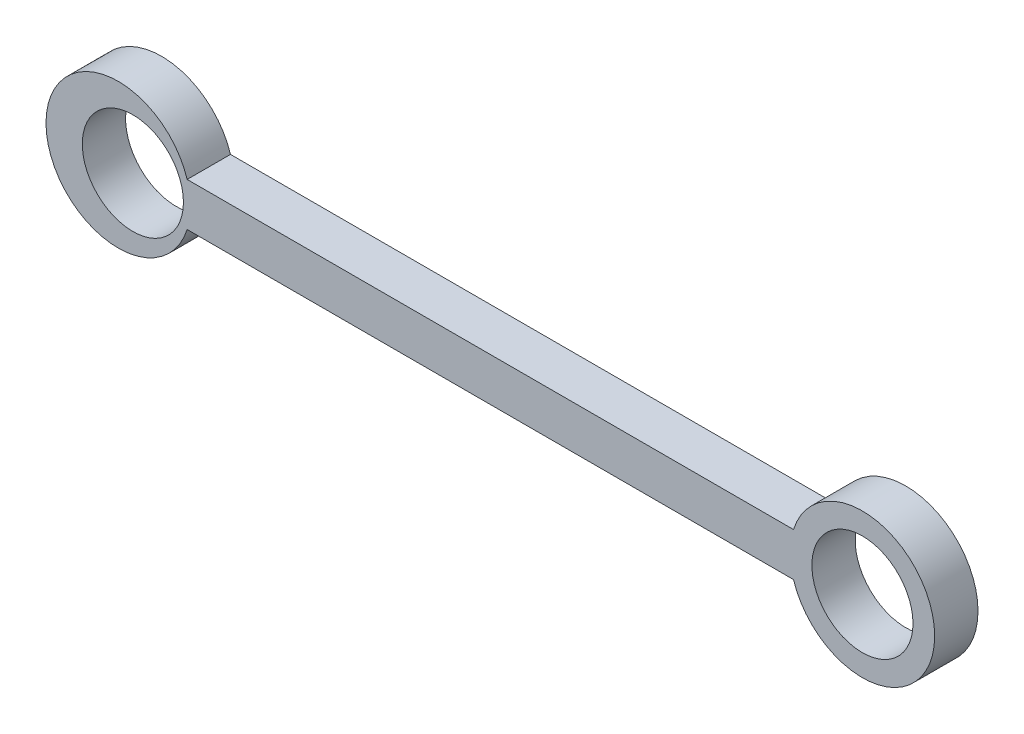
ISO-10303-21;
HEADER;
FILE_DESCRIPTION(('STEP AP214'),'2;1');
FILE_NAME('part.step','',(''),(''),'','','');
FILE_SCHEMA(('AUTOMOTIVE_DESIGN { 1 0 10303 214 1 1 1 1 }'));
ENDSEC;
DATA;
#1=APPLICATION_CONTEXT('core data for automotive mechanical design processes');
#2=APPLICATION_PROTOCOL_DEFINITION('international standard','automotive_design',2000,#1);
#3=PRODUCT_CONTEXT('',#1,'mechanical');
#4=PRODUCT('Part','Part','',(#3));
#5=PRODUCT_RELATED_PRODUCT_CATEGORY('part','',(#4));
#6=PRODUCT_DEFINITION_FORMATION('','',#4);
#7=PRODUCT_DEFINITION_CONTEXT('part definition',#1,'design');
#8=PRODUCT_DEFINITION('design','',#6,#7);
#9=PRODUCT_DEFINITION_SHAPE('','',#8);
#10=(LENGTH_UNIT() NAMED_UNIT(*) SI_UNIT(.MILLI.,.METRE.));
#11=(NAMED_UNIT(*) PLANE_ANGLE_UNIT() SI_UNIT($,.RADIAN.));
#12=(NAMED_UNIT(*) SI_UNIT($,.STERADIAN.) SOLID_ANGLE_UNIT());
#13=UNCERTAINTY_MEASURE_WITH_UNIT(LENGTH_MEASURE(1.E-05),#10,'distance_accuracy_value','');
#14=(GEOMETRIC_REPRESENTATION_CONTEXT(3) GLOBAL_UNCERTAINTY_ASSIGNED_CONTEXT((#13)) GLOBAL_UNIT_ASSIGNED_CONTEXT((#10,
#11,#12)) REPRESENTATION_CONTEXT('',''));
#15=CARTESIAN_POINT('',(0.,0.,0.));
#16=DIRECTION('',(0.,0.,1.));
#17=DIRECTION('',(1.,0.,0.));
#18=AXIS2_PLACEMENT_3D('',#15,#16,#17);
#19=CARTESIAN_POINT('',(-13.1308487097155,0.75,1.5));
#20=DIRECTION('',(0.,0.,1.));
#21=DIRECTION('',(1.,0.,0.));
#22=AXIS2_PLACEMENT_3D('',#19,#20,#21);
#23=PLANE('',#22);
#24=CARTESIAN_POINT('',(-12.625,0.75,1.5));
#25=DIRECTION('',(0.,0.,1.));
#26=DIRECTION('',(1.,0.,0.));
#27=AXIS2_PLACEMENT_3D('',#24,#25,#26);
#28=CIRCLE('',#27,1.75);
#29=CARTESIAN_POINT('',(-10.875,0.75,1.5));
#30=VERTEX_POINT('',#29);
#31=EDGE_CURVE('E116',#30,#30,#28,.T.);
#32=ORIENTED_EDGE('',*,*,#31,.F.);
#33=EDGE_LOOP('',(#32));
#34=FACE_BOUND('',#33,.T.);
#35=CARTESIAN_POINT('',(-13.1308487097155,0.75,1.5));
#36=DIRECTION('',(0.,0.,1.));
#37=DIRECTION('',(1.,0.,0.));
#38=AXIS2_PLACEMENT_3D('',#35,#36,#37);
#39=CIRCLE('',#38,2.5);
#40=CARTESIAN_POINT('',(-10.7460007061731,1.5,1.5));
#41=VERTEX_POINT('',#40);
#42=CARTESIAN_POINT('',(-10.7460007061731,0.,1.5));
#43=VERTEX_POINT('',#42);
#44=EDGE_CURVE('E96',#41,#43,#39,.T.);
#45=ORIENTED_EDGE('',*,*,#44,.T.);
#46=DIRECTION('',(1.,0.,0.));
#47=VECTOR('',#46,1.);
#48=CARTESIAN_POINT('',(10.2401519964576,0.,1.5));
#49=LINE('',#48,#47);
#50=CARTESIAN_POINT('',(10.2401519964576,0.,1.5));
#51=VERTEX_POINT('',#50);
#52=EDGE_CURVE('E91',#43,#51,#49,.T.);
#53=ORIENTED_EDGE('',*,*,#52,.T.);
#54=CARTESIAN_POINT('',(12.625,0.75,1.5));
#55=DIRECTION('',(0.,0.,1.));
#56=DIRECTION('',(1.,0.,0.));
#57=AXIS2_PLACEMENT_3D('',#54,#55,#56);
#58=CIRCLE('',#57,2.5);
#59=CARTESIAN_POINT('',(10.2401519964576,1.5,1.5));
#60=VERTEX_POINT('',#59);
#61=EDGE_CURVE('E94',#51,#60,#58,.T.);
#62=ORIENTED_EDGE('',*,*,#61,.T.);
#63=DIRECTION('',(-1.,0.,0.));
#64=VECTOR('',#63,1.);
#65=CARTESIAN_POINT('',(10.2401519964576,1.5,1.5));
#66=LINE('',#65,#64);
#67=EDGE_CURVE('E61',#60,#41,#66,.T.);
#68=ORIENTED_EDGE('',*,*,#67,.T.);
#69=EDGE_LOOP('',(#45,#53,#62,#68));
#70=FACE_BOUND('',#69,.T.);
#71=CARTESIAN_POINT('',(12.625,0.75,1.5));
#72=DIRECTION('',(0.,0.,1.));
#73=DIRECTION('',(1.,0.,0.));
#74=AXIS2_PLACEMENT_3D('',#71,#72,#73);
#75=CIRCLE('',#74,1.75);
#76=CARTESIAN_POINT('',(14.375,0.75,1.5));
#77=VERTEX_POINT('',#76);
#78=EDGE_CURVE('E138',#77,#77,#75,.T.);
#79=ORIENTED_EDGE('',*,*,#78,.F.);
#80=EDGE_LOOP('',(#79));
#81=FACE_BOUND('',#80,.T.);
#82=ADVANCED_FACE('F43',(#34,#70,#81),#23,.T.);
#83=CARTESIAN_POINT('',(-13.1308487097155,0.75,0.));
#84=DIRECTION('',(0.,0.,1.));
#85=DIRECTION('',(1.,0.,0.));
#86=AXIS2_PLACEMENT_3D('',#83,#84,#85);
#87=PLANE('',#86);
#88=CARTESIAN_POINT('',(-13.1308487097155,0.75,0.));
#89=DIRECTION('',(0.,0.,1.));
#90=DIRECTION('',(1.,0.,0.));
#91=AXIS2_PLACEMENT_3D('',#88,#89,#90);
#92=CIRCLE('',#91,2.5);
#93=CARTESIAN_POINT('',(-10.7460007061731,1.5,0.));
#94=VERTEX_POINT('',#93);
#95=CARTESIAN_POINT('',(-10.7460007061731,0.,0.));
#96=VERTEX_POINT('',#95);
#97=EDGE_CURVE('E112',#94,#96,#92,.T.);
#98=ORIENTED_EDGE('',*,*,#97,.F.);
#99=DIRECTION('',(-1.,0.,0.));
#100=VECTOR('',#99,1.);
#101=CARTESIAN_POINT('',(10.2401519964576,1.5,0.));
#102=LINE('',#101,#100);
#103=CARTESIAN_POINT('',(10.2401519964576,1.5,0.));
#104=VERTEX_POINT('',#103);
#105=EDGE_CURVE('E84',#104,#94,#102,.T.);
#106=ORIENTED_EDGE('',*,*,#105,.F.);
#107=CARTESIAN_POINT('',(12.625,0.75,0.));
#108=DIRECTION('',(0.,0.,1.));
#109=DIRECTION('',(1.,0.,0.));
#110=AXIS2_PLACEMENT_3D('',#107,#108,#109);
#111=CIRCLE('',#110,2.5);
#112=CARTESIAN_POINT('',(10.2401519964576,0.,0.));
#113=VERTEX_POINT('',#112);
#114=EDGE_CURVE('E78',#113,#104,#111,.T.);
#115=ORIENTED_EDGE('',*,*,#114,.F.);
#116=DIRECTION('',(1.,0.,0.));
#117=VECTOR('',#116,1.);
#118=CARTESIAN_POINT('',(10.2401519964576,0.,0.));
#119=LINE('',#118,#117);
#120=EDGE_CURVE('E101',#96,#113,#119,.T.);
#121=ORIENTED_EDGE('',*,*,#120,.F.);
#122=EDGE_LOOP('',(#98,#106,#115,#121));
#123=FACE_BOUND('',#122,.T.);
#124=CARTESIAN_POINT('',(-12.625,0.75,0.));
#125=DIRECTION('',(0.,0.,1.));
#126=DIRECTION('',(1.,0.,0.));
#127=AXIS2_PLACEMENT_3D('',#124,#125,#126);
#128=CIRCLE('',#127,1.75);
#129=CARTESIAN_POINT('',(-10.875,0.75,0.));
#130=VERTEX_POINT('',#129);
#131=EDGE_CURVE('E134',#130,#130,#128,.T.);
#132=ORIENTED_EDGE('',*,*,#131,.T.);
#133=EDGE_LOOP('',(#132));
#134=FACE_BOUND('',#133,.T.);
#135=CARTESIAN_POINT('',(12.625,0.75,0.));
#136=DIRECTION('',(0.,0.,1.));
#137=DIRECTION('',(1.,0.,0.));
#138=AXIS2_PLACEMENT_3D('',#135,#136,#137);
#139=CIRCLE('',#138,1.75);
#140=CARTESIAN_POINT('',(14.375,0.75,0.));
#141=VERTEX_POINT('',#140);
#142=EDGE_CURVE('E142',#141,#141,#139,.T.);
#143=ORIENTED_EDGE('',*,*,#142,.T.);
#144=EDGE_LOOP('',(#143));
#145=FACE_BOUND('',#144,.T.);
#146=ADVANCED_FACE('F129',(#123,#134,#145),#87,.F.);
#147=CARTESIAN_POINT('',(-13.1308487097155,0.75,1.5));
#148=DIRECTION('',(0.,0.,-1.));
#149=DIRECTION('',(-1.,0.,0.));
#150=AXIS2_PLACEMENT_3D('',#147,#148,#149);
#151=CYLINDRICAL_SURFACE('',#150,2.5);
#152=ORIENTED_EDGE('',*,*,#97,.T.);
#153=DIRECTION('',(0.,0.,-1.));
#154=VECTOR('',#153,1.);
#155=CARTESIAN_POINT('',(-10.7460007061731,0.,1.5));
#156=LINE('',#155,#154);
#157=EDGE_CURVE('E11',#43,#96,#156,.T.);
#158=ORIENTED_EDGE('',*,*,#157,.F.);
#159=ORIENTED_EDGE('',*,*,#44,.F.);
#160=DIRECTION('',(0.,0.,-1.));
#161=VECTOR('',#160,1.);
#162=CARTESIAN_POINT('',(-10.7460007061731,1.5,1.5));
#163=LINE('',#162,#161);
#164=EDGE_CURVE('E108',#41,#94,#163,.T.);
#165=ORIENTED_EDGE('',*,*,#164,.T.);
#166=EDGE_LOOP('',(#152,#158,#159,#165));
#167=FACE_BOUND('',#166,.T.);
#168=ADVANCED_FACE('F45',(#167),#151,.T.);
#169=CARTESIAN_POINT('',(10.2401519964576,0.,1.5));
#170=DIRECTION('',(0.,1.,0.));
#171=DIRECTION('',(0.,0.,1.));
#172=AXIS2_PLACEMENT_3D('',#169,#170,#171);
#173=PLANE('',#172);
#174=ORIENTED_EDGE('',*,*,#120,.T.);
#175=DIRECTION('',(0.,0.,-1.));
#176=VECTOR('',#175,1.);
#177=CARTESIAN_POINT('',(10.2401519964576,0.,1.5));
#178=LINE('',#177,#176);
#179=EDGE_CURVE('E53',#51,#113,#178,.T.);
#180=ORIENTED_EDGE('',*,*,#179,.F.);
#181=ORIENTED_EDGE('',*,*,#52,.F.);
#182=ORIENTED_EDGE('',*,*,#157,.T.);
#183=EDGE_LOOP('',(#174,#180,#181,#182));
#184=FACE_BOUND('',#183,.T.);
#185=ADVANCED_FACE('F100',(#184),#173,.F.);
#186=CARTESIAN_POINT('',(12.625,0.75,1.5));
#187=DIRECTION('',(0.,0.,-1.));
#188=DIRECTION('',(-1.,0.,0.));
#189=AXIS2_PLACEMENT_3D('',#186,#187,#188);
#190=CYLINDRICAL_SURFACE('',#189,2.5);
#191=ORIENTED_EDGE('',*,*,#114,.T.);
#192=DIRECTION('',(0.,0.,-1.));
#193=VECTOR('',#192,1.);
#194=CARTESIAN_POINT('',(10.2401519964576,1.5,1.5));
#195=LINE('',#194,#193);
#196=EDGE_CURVE('E103',#60,#104,#195,.T.);
#197=ORIENTED_EDGE('',*,*,#196,.F.);
#198=ORIENTED_EDGE('',*,*,#61,.F.);
#199=ORIENTED_EDGE('',*,*,#179,.T.);
#200=EDGE_LOOP('',(#191,#197,#198,#199));
#201=FACE_BOUND('',#200,.T.);
#202=ADVANCED_FACE('F104',(#201),#190,.T.);
#203=CARTESIAN_POINT('',(10.2401519964576,1.5,1.5));
#204=DIRECTION('',(0.,-1.,0.));
#205=DIRECTION('',(0.,0.,-1.));
#206=AXIS2_PLACEMENT_3D('',#203,#204,#205);
#207=PLANE('',#206);
#208=ORIENTED_EDGE('',*,*,#105,.T.);
#209=ORIENTED_EDGE('',*,*,#164,.F.);
#210=ORIENTED_EDGE('',*,*,#67,.F.);
#211=ORIENTED_EDGE('',*,*,#196,.T.);
#212=EDGE_LOOP('',(#208,#209,#210,#211));
#213=FACE_BOUND('',#212,.T.);
#214=ADVANCED_FACE('F126',(#213),#207,.F.);
#215=CARTESIAN_POINT('',(-12.625,0.75,1.5));
#216=DIRECTION('',(0.,0.,-1.));
#217=DIRECTION('',(-1.,0.,0.));
#218=AXIS2_PLACEMENT_3D('',#215,#216,#217);
#219=CYLINDRICAL_SURFACE('',#218,1.75);
#220=ORIENTED_EDGE('',*,*,#31,.T.);
#221=EDGE_LOOP('',(#220));
#222=FACE_BOUND('',#221,.T.);
#223=ORIENTED_EDGE('',*,*,#131,.F.);
#224=EDGE_LOOP('',(#223));
#225=FACE_BOUND('',#224,.T.);
#226=ADVANCED_FACE('F161',(#222,#225),#219,.F.);
#227=CARTESIAN_POINT('',(12.625,0.75,1.5));
#228=DIRECTION('',(0.,0.,-1.));
#229=DIRECTION('',(-1.,0.,0.));
#230=AXIS2_PLACEMENT_3D('',#227,#228,#229);
#231=CYLINDRICAL_SURFACE('',#230,1.75);
#232=ORIENTED_EDGE('',*,*,#78,.T.);
#233=EDGE_LOOP('',(#232));
#234=FACE_BOUND('',#233,.T.);
#235=ORIENTED_EDGE('',*,*,#142,.F.);
#236=EDGE_LOOP('',(#235));
#237=FACE_BOUND('',#236,.T.);
#238=ADVANCED_FACE('F150',(#234,#237),#231,.F.);
#239=CLOSED_SHELL('',(#82,#146,#168,#185,#202,#214,#226,#238));
#240=MANIFOLD_SOLID_BREP('B2',#239);
#241=ADVANCED_BREP_SHAPE_REPRESENTATION('',(#18,#240),#14);
#242=SHAPE_DEFINITION_REPRESENTATION(#9,#241);
ENDSEC;
END-ISO-10303-21;
